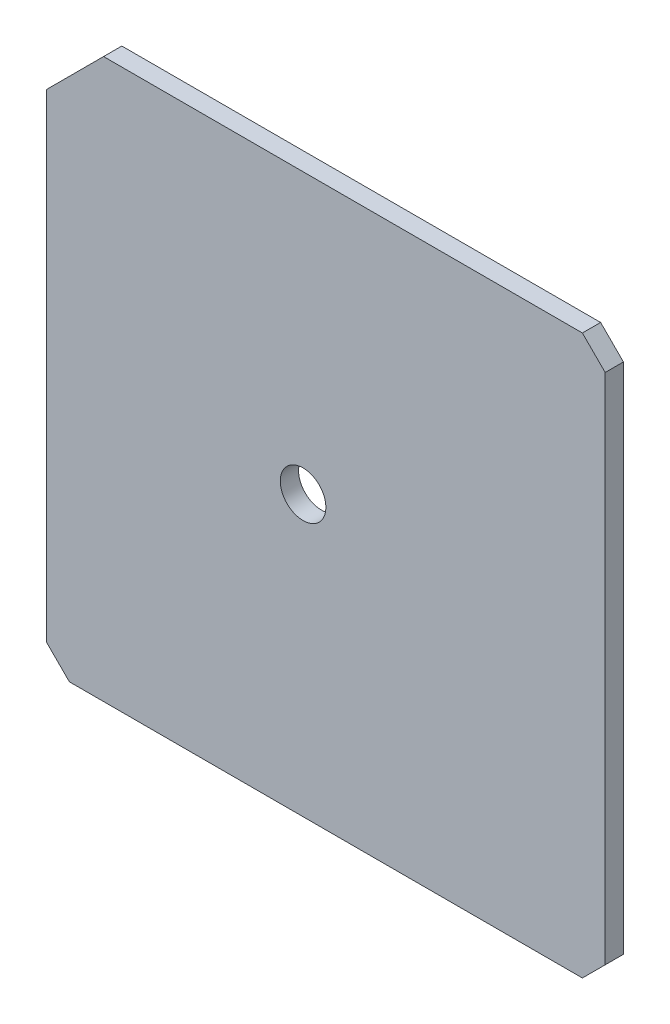
ISO-10303-21;
HEADER;
FILE_DESCRIPTION(('STEP AP214'),'2;1');
FILE_NAME('part.step','',(''),(''),'','','');
FILE_SCHEMA(('AUTOMOTIVE_DESIGN { 1 0 10303 214 1 1 1 1 }'));
ENDSEC;
DATA;
#1=APPLICATION_CONTEXT('core data for automotive mechanical design processes');
#2=APPLICATION_PROTOCOL_DEFINITION('international standard','automotive_design',2000,#1);
#3=PRODUCT_CONTEXT('',#1,'mechanical');
#4=PRODUCT('Part','Part','',(#3));
#5=PRODUCT_RELATED_PRODUCT_CATEGORY('part','',(#4));
#6=PRODUCT_DEFINITION_FORMATION('','',#4);
#7=PRODUCT_DEFINITION_CONTEXT('part definition',#1,'design');
#8=PRODUCT_DEFINITION('design','',#6,#7);
#9=PRODUCT_DEFINITION_SHAPE('','',#8);
#10=(LENGTH_UNIT() NAMED_UNIT(*) SI_UNIT(.MILLI.,.METRE.));
#11=(NAMED_UNIT(*) PLANE_ANGLE_UNIT() SI_UNIT($,.RADIAN.));
#12=(NAMED_UNIT(*) SI_UNIT($,.STERADIAN.) SOLID_ANGLE_UNIT());
#13=UNCERTAINTY_MEASURE_WITH_UNIT(LENGTH_MEASURE(1.E-05),#10,'distance_accuracy_value','');
#14=(GEOMETRIC_REPRESENTATION_CONTEXT(3) GLOBAL_UNCERTAINTY_ASSIGNED_CONTEXT((#13)) GLOBAL_UNIT_ASSIGNED_CONTEXT((#10,
#11,#12)) REPRESENTATION_CONTEXT('',''));
#15=CARTESIAN_POINT('',(0.,0.,0.));
#16=DIRECTION('',(0.,0.,1.));
#17=DIRECTION('',(1.,0.,0.));
#18=AXIS2_PLACEMENT_3D('',#15,#16,#17);
#19=CARTESIAN_POINT('',(0.,0.,-1.6));
#20=DIRECTION('',(0.,-1.,0.));
#21=DIRECTION('',(0.,0.,-1.));
#22=AXIS2_PLACEMENT_3D('',#19,#20,#21);
#23=PLANE('',#22);
#24=DIRECTION('',(1.,0.,0.));
#25=VECTOR('',#24,1.);
#26=CARTESIAN_POINT('',(0.,0.,-1.6));
#27=LINE('',#26,#25);
#28=CARTESIAN_POINT('',(-47.,0.,-1.6));
#29=VERTEX_POINT('',#28);
#30=CARTESIAN_POINT('',(-2.00000000000001,0.,-1.6));
#31=VERTEX_POINT('',#30);
#32=EDGE_CURVE('E164',#29,#31,#27,.T.);
#33=ORIENTED_EDGE('',*,*,#32,.T.);
#34=DIRECTION('',(0.,0.,1.));
#35=VECTOR('',#34,1.);
#36=CARTESIAN_POINT('',(-2.00000000000001,0.,-1.6));
#37=LINE('',#36,#35);
#38=CARTESIAN_POINT('',(-2.00000000000001,0.,0.));
#39=VERTEX_POINT('',#38);
#40=EDGE_CURVE('E50',#31,#39,#37,.T.);
#41=ORIENTED_EDGE('',*,*,#40,.T.);
#42=DIRECTION('',(1.,0.,0.));
#43=VECTOR('',#42,1.);
#44=CARTESIAN_POINT('',(0.,0.,0.));
#45=LINE('',#44,#43);
#46=CARTESIAN_POINT('',(-47.,0.,0.));
#47=VERTEX_POINT('',#46);
#48=EDGE_CURVE('E163',#47,#39,#45,.T.);
#49=ORIENTED_EDGE('',*,*,#48,.F.);
#50=DIRECTION('',(0.,0.,-1.));
#51=VECTOR('',#50,1.);
#52=CARTESIAN_POINT('',(-47.,0.,-1.6));
#53=LINE('',#52,#51);
#54=EDGE_CURVE('E64',#47,#29,#53,.T.);
#55=ORIENTED_EDGE('',*,*,#54,.T.);
#56=EDGE_LOOP('',(#33,#41,#49,#55));
#57=FACE_BOUND('',#56,.T.);
#58=ADVANCED_FACE('F41',(#57),#23,.T.);
#59=CARTESIAN_POINT('',(-49.,0.,-1.6));
#60=DIRECTION('',(-1.,0.,0.));
#61=DIRECTION('',(0.,0.,1.));
#62=AXIS2_PLACEMENT_3D('',#59,#60,#61);
#63=PLANE('',#62);
#64=DIRECTION('',(0.,-1.,0.));
#65=VECTOR('',#64,1.);
#66=CARTESIAN_POINT('',(-49.,0.,-1.6));
#67=LINE('',#66,#65);
#68=CARTESIAN_POINT('',(-49.,44.,-1.6));
#69=VERTEX_POINT('',#68);
#70=CARTESIAN_POINT('',(-49.,2.00000000000001,-1.6));
#71=VERTEX_POINT('',#70);
#72=EDGE_CURVE('E134',#69,#71,#67,.T.);
#73=ORIENTED_EDGE('',*,*,#72,.T.);
#74=DIRECTION('',(0.,0.,1.));
#75=VECTOR('',#74,1.);
#76=CARTESIAN_POINT('',(-49.,2.00000000000001,-1.6));
#77=LINE('',#76,#75);
#78=CARTESIAN_POINT('',(-49.,2.00000000000001,0.));
#79=VERTEX_POINT('',#78);
#80=EDGE_CURVE('E11',#71,#79,#77,.T.);
#81=ORIENTED_EDGE('',*,*,#80,.T.);
#82=DIRECTION('',(0.,-1.,0.));
#83=VECTOR('',#82,1.);
#84=CARTESIAN_POINT('',(-49.,0.,0.));
#85=LINE('',#84,#83);
#86=CARTESIAN_POINT('',(-49.,44.,0.));
#87=VERTEX_POINT('',#86);
#88=EDGE_CURVE('E119',#87,#79,#85,.T.);
#89=ORIENTED_EDGE('',*,*,#88,.F.);
#90=DIRECTION('',(0.,0.,-1.));
#91=VECTOR('',#90,1.);
#92=CARTESIAN_POINT('',(-49.,44.,-1.6));
#93=LINE('',#92,#91);
#94=EDGE_CURVE('E128',#87,#69,#93,.T.);
#95=ORIENTED_EDGE('',*,*,#94,.T.);
#96=EDGE_LOOP('',(#73,#81,#89,#95));
#97=FACE_BOUND('',#96,.T.);
#98=ADVANCED_FACE('F199',(#97),#63,.T.);
#99=CARTESIAN_POINT('',(0.,49.,-1.6));
#100=DIRECTION('',(0.,1.,0.));
#101=DIRECTION('',(0.,0.,1.));
#102=AXIS2_PLACEMENT_3D('',#99,#100,#101);
#103=PLANE('',#102);
#104=DIRECTION('',(-1.,0.,0.));
#105=VECTOR('',#104,1.);
#106=CARTESIAN_POINT('',(0.,49.,0.));
#107=LINE('',#106,#105);
#108=CARTESIAN_POINT('',(-2.00000000000002,49.,0.));
#109=VERTEX_POINT('',#108);
#110=CARTESIAN_POINT('',(-44.,49.,0.));
#111=VERTEX_POINT('',#110);
#112=EDGE_CURVE('E108',#109,#111,#107,.T.);
#113=ORIENTED_EDGE('',*,*,#112,.F.);
#114=DIRECTION('',(0.,0.,-1.));
#115=VECTOR('',#114,1.);
#116=CARTESIAN_POINT('',(-2.00000000000002,49.,-1.6));
#117=LINE('',#116,#115);
#118=CARTESIAN_POINT('',(-2.00000000000002,49.,-1.6));
#119=VERTEX_POINT('',#118);
#120=EDGE_CURVE('E153',#109,#119,#117,.T.);
#121=ORIENTED_EDGE('',*,*,#120,.T.);
#122=DIRECTION('',(-1.,0.,0.));
#123=VECTOR('',#122,1.);
#124=CARTESIAN_POINT('',(0.,49.,-1.6));
#125=LINE('',#124,#123);
#126=CARTESIAN_POINT('',(-44.,49.,-1.6));
#127=VERTEX_POINT('',#126);
#128=EDGE_CURVE('E132',#119,#127,#125,.T.);
#129=ORIENTED_EDGE('',*,*,#128,.T.);
#130=DIRECTION('',(0.,0.,1.));
#131=VECTOR('',#130,1.);
#132=CARTESIAN_POINT('',(-44.,49.,-1.6));
#133=LINE('',#132,#131);
#134=EDGE_CURVE('E127',#127,#111,#133,.T.);
#135=ORIENTED_EDGE('',*,*,#134,.T.);
#136=EDGE_LOOP('',(#113,#121,#129,#135));
#137=FACE_BOUND('',#136,.T.);
#138=ADVANCED_FACE('F130',(#137),#103,.T.);
#139=CARTESIAN_POINT('',(0.,0.,-1.6));
#140=DIRECTION('',(1.,0.,0.));
#141=DIRECTION('',(0.,0.,-1.));
#142=AXIS2_PLACEMENT_3D('',#139,#140,#141);
#143=PLANE('',#142);
#144=DIRECTION('',(0.,1.,0.));
#145=VECTOR('',#144,1.);
#146=CARTESIAN_POINT('',(0.,0.,-1.6));
#147=LINE('',#146,#145);
#148=CARTESIAN_POINT('',(0.,2.00000000000002,-1.6));
#149=VERTEX_POINT('',#148);
#150=CARTESIAN_POINT('',(0.,47.,-1.6));
#151=VERTEX_POINT('',#150);
#152=EDGE_CURVE('E175',#149,#151,#147,.T.);
#153=ORIENTED_EDGE('',*,*,#152,.T.);
#154=DIRECTION('',(0.,0.,1.));
#155=VECTOR('',#154,1.);
#156=CARTESIAN_POINT('',(0.,47.,-1.6));
#157=LINE('',#156,#155);
#158=CARTESIAN_POINT('',(0.,47.,0.));
#159=VERTEX_POINT('',#158);
#160=EDGE_CURVE('E145',#151,#159,#157,.T.);
#161=ORIENTED_EDGE('',*,*,#160,.T.);
#162=DIRECTION('',(0.,1.,0.));
#163=VECTOR('',#162,1.);
#164=CARTESIAN_POINT('',(0.,0.,0.));
#165=LINE('',#164,#163);
#166=CARTESIAN_POINT('',(0.,2.00000000000002,0.));
#167=VERTEX_POINT('',#166);
#168=EDGE_CURVE('E120',#167,#159,#165,.T.);
#169=ORIENTED_EDGE('',*,*,#168,.F.);
#170=DIRECTION('',(0.,0.,-1.));
#171=VECTOR('',#170,1.);
#172=CARTESIAN_POINT('',(0.,2.00000000000002,-1.6));
#173=LINE('',#172,#171);
#174=EDGE_CURVE('E143',#167,#149,#173,.T.);
#175=ORIENTED_EDGE('',*,*,#174,.T.);
#176=EDGE_LOOP('',(#153,#161,#169,#175));
#177=FACE_BOUND('',#176,.T.);
#178=ADVANCED_FACE('F194',(#177),#143,.T.);
#179=CARTESIAN_POINT('',(0.,0.,-1.6));
#180=DIRECTION('',(0.,0.,-1.));
#181=DIRECTION('',(-1.,0.,0.));
#182=AXIS2_PLACEMENT_3D('',#179,#180,#181);
#183=PLANE('',#182);
#184=CARTESIAN_POINT('',(-26.5,24.5,-1.6));
#185=DIRECTION('',(0.,0.,1.));
#186=DIRECTION('',(1.,0.,0.));
#187=AXIS2_PLACEMENT_3D('',#184,#185,#186);
#188=CIRCLE('',#187,2.);
#189=CARTESIAN_POINT('',(-24.5,24.5,-1.6));
#190=VERTEX_POINT('',#189);
#191=EDGE_CURVE('E167',#190,#190,#188,.T.);
#192=ORIENTED_EDGE('',*,*,#191,.T.);
#193=EDGE_LOOP('',(#192));
#194=FACE_BOUND('',#193,.T.);
#195=ORIENTED_EDGE('',*,*,#128,.F.);
#196=DIRECTION('',(-0.707106781186549,0.707106781186546,0.));
#197=VECTOR('',#196,1.);
#198=CARTESIAN_POINT('',(23.5,23.5000000000001,-1.6));
#199=LINE('',#198,#197);
#200=EDGE_CURVE('E158',#119,#151,#199,.F.);
#201=ORIENTED_EDGE('',*,*,#200,.T.);
#202=ORIENTED_EDGE('',*,*,#152,.F.);
#203=DIRECTION('',(0.707106781186546,0.707106781186549,0.));
#204=VECTOR('',#203,1.);
#205=CARTESIAN_POINT('',(-1.00000000000001,1.,-1.6));
#206=LINE('',#205,#204);
#207=EDGE_CURVE('E57',#149,#31,#206,.F.);
#208=ORIENTED_EDGE('',*,*,#207,.T.);
#209=ORIENTED_EDGE('',*,*,#32,.F.);
#210=DIRECTION('',(0.707106781186549,-0.707106781186546,0.));
#211=VECTOR('',#210,1.);
#212=CARTESIAN_POINT('',(-23.4999999999999,-23.5,-1.6));
#213=LINE('',#212,#211);
#214=EDGE_CURVE('E155',#29,#71,#213,.F.);
#215=ORIENTED_EDGE('',*,*,#214,.T.);
#216=ORIENTED_EDGE('',*,*,#72,.F.);
#217=DIRECTION('',(-0.707106781186546,-0.70710678118655,0.));
#218=VECTOR('',#217,1.);
#219=CARTESIAN_POINT('',(-46.5000000000001,46.4999999999999,-1.6));
#220=LINE('',#219,#218);
#221=EDGE_CURVE('E141',#69,#127,#220,.F.);
#222=ORIENTED_EDGE('',*,*,#221,.T.);
#223=EDGE_LOOP('',(#195,#201,#202,#208,#209,#215,#216,#222));
#224=FACE_BOUND('',#223,.T.);
#225=ADVANCED_FACE('F185',(#194,#224),#183,.T.);
#226=CARTESIAN_POINT('',(0.,0.,0.));
#227=DIRECTION('',(0.,0.,-1.));
#228=DIRECTION('',(-1.,0.,0.));
#229=AXIS2_PLACEMENT_3D('',#226,#227,#228);
#230=PLANE('',#229);
#231=CARTESIAN_POINT('',(-26.5,24.5,0.));
#232=DIRECTION('',(0.,0.,1.));
#233=DIRECTION('',(1.,0.,0.));
#234=AXIS2_PLACEMENT_3D('',#231,#232,#233);
#235=CIRCLE('',#234,2.);
#236=CARTESIAN_POINT('',(-24.5,24.5,0.));
#237=VERTEX_POINT('',#236);
#238=EDGE_CURVE('E171',#237,#237,#235,.T.);
#239=ORIENTED_EDGE('',*,*,#238,.F.);
#240=EDGE_LOOP('',(#239));
#241=FACE_BOUND('',#240,.T.);
#242=ORIENTED_EDGE('',*,*,#168,.T.);
#243=DIRECTION('',(0.707106781186549,-0.707106781186546,0.));
#244=VECTOR('',#243,1.);
#245=CARTESIAN_POINT('',(0.,47.,0.));
#246=LINE('',#245,#244);
#247=EDGE_CURVE('E115',#159,#109,#246,.F.);
#248=ORIENTED_EDGE('',*,*,#247,.T.);
#249=ORIENTED_EDGE('',*,*,#112,.T.);
#250=DIRECTION('',(0.707106781186546,0.70710678118655,0.));
#251=VECTOR('',#250,1.);
#252=CARTESIAN_POINT('',(-44.,49.,0.));
#253=LINE('',#252,#251);
#254=EDGE_CURVE('E113',#111,#87,#253,.F.);
#255=ORIENTED_EDGE('',*,*,#254,.T.);
#256=ORIENTED_EDGE('',*,*,#88,.T.);
#257=DIRECTION('',(-0.707106781186549,0.707106781186546,0.));
#258=VECTOR('',#257,1.);
#259=CARTESIAN_POINT('',(-49.,2.00000000000001,0.));
#260=LINE('',#259,#258);
#261=EDGE_CURVE('E148',#79,#47,#260,.F.);
#262=ORIENTED_EDGE('',*,*,#261,.T.);
#263=ORIENTED_EDGE('',*,*,#48,.T.);
#264=DIRECTION('',(-0.707106781186546,-0.707106781186549,0.));
#265=VECTOR('',#264,1.);
#266=CARTESIAN_POINT('',(-2.00000000000001,0.,0.));
#267=LINE('',#266,#265);
#268=EDGE_CURVE('E150',#39,#167,#267,.F.);
#269=ORIENTED_EDGE('',*,*,#268,.T.);
#270=EDGE_LOOP('',(#242,#248,#249,#255,#256,#262,#263,#269));
#271=FACE_BOUND('',#270,.T.);
#272=ADVANCED_FACE('F111',(#241,#271),#230,.F.);
#273=CARTESIAN_POINT('',(-26.5,24.5,-1.6));
#274=DIRECTION('',(0.,0.,1.));
#275=DIRECTION('',(1.,0.,0.));
#276=AXIS2_PLACEMENT_3D('',#273,#274,#275);
#277=CYLINDRICAL_SURFACE('',#276,2.);
#278=ORIENTED_EDGE('',*,*,#191,.F.);
#279=EDGE_LOOP('',(#278));
#280=FACE_BOUND('',#279,.T.);
#281=ORIENTED_EDGE('',*,*,#238,.T.);
#282=EDGE_LOOP('',(#281));
#283=FACE_BOUND('',#282,.T.);
#284=ADVANCED_FACE('F182',(#280,#283),#277,.F.);
#285=CARTESIAN_POINT('',(-44.,49.,-1.6));
#286=DIRECTION('',(0.707106781186549,-0.707106781186545,0.));
#287=DIRECTION('',(0.,0.,1.));
#288=AXIS2_PLACEMENT_3D('',#285,#286,#287);
#289=PLANE('',#288);
#290=ORIENTED_EDGE('',*,*,#221,.F.);
#291=ORIENTED_EDGE('',*,*,#94,.F.);
#292=ORIENTED_EDGE('',*,*,#254,.F.);
#293=ORIENTED_EDGE('',*,*,#134,.F.);
#294=EDGE_LOOP('',(#290,#291,#292,#293));
#295=FACE_BOUND('',#294,.T.);
#296=ADVANCED_FACE('F126',(#295),#289,.F.);
#297=CARTESIAN_POINT('',(0.,47.,-1.6));
#298=DIRECTION('',(-0.707106781186546,-0.707106781186549,0.));
#299=DIRECTION('',(0.,0.,1.));
#300=AXIS2_PLACEMENT_3D('',#297,#298,#299);
#301=PLANE('',#300);
#302=ORIENTED_EDGE('',*,*,#200,.F.);
#303=ORIENTED_EDGE('',*,*,#120,.F.);
#304=ORIENTED_EDGE('',*,*,#247,.F.);
#305=ORIENTED_EDGE('',*,*,#160,.F.);
#306=EDGE_LOOP('',(#302,#303,#304,#305));
#307=FACE_BOUND('',#306,.T.);
#308=ADVANCED_FACE('F214',(#307),#301,.F.);
#309=CARTESIAN_POINT('',(-2.00000000000001,0.,-1.6));
#310=DIRECTION('',(-0.707106781186549,0.707106781186546,0.));
#311=DIRECTION('',(0.,0.,1.));
#312=AXIS2_PLACEMENT_3D('',#309,#310,#311);
#313=PLANE('',#312);
#314=ORIENTED_EDGE('',*,*,#207,.F.);
#315=ORIENTED_EDGE('',*,*,#174,.F.);
#316=ORIENTED_EDGE('',*,*,#268,.F.);
#317=ORIENTED_EDGE('',*,*,#40,.F.);
#318=EDGE_LOOP('',(#314,#315,#316,#317));
#319=FACE_BOUND('',#318,.T.);
#320=ADVANCED_FACE('F218',(#319),#313,.F.);
#321=CARTESIAN_POINT('',(-49.,2.00000000000001,-1.6));
#322=DIRECTION('',(0.707106781186546,0.707106781186549,0.));
#323=DIRECTION('',(0.,0.,1.));
#324=AXIS2_PLACEMENT_3D('',#321,#322,#323);
#325=PLANE('',#324);
#326=ORIENTED_EDGE('',*,*,#214,.F.);
#327=ORIENTED_EDGE('',*,*,#54,.F.);
#328=ORIENTED_EDGE('',*,*,#261,.F.);
#329=ORIENTED_EDGE('',*,*,#80,.F.);
#330=EDGE_LOOP('',(#326,#327,#328,#329));
#331=FACE_BOUND('',#330,.T.);
#332=ADVANCED_FACE('F44',(#331),#325,.F.);
#333=CLOSED_SHELL('',(#58,#98,#138,#178,#225,#272,#284,#296,#308,#320,#332));
#334=MANIFOLD_SOLID_BREP('B2',#333);
#335=ADVANCED_BREP_SHAPE_REPRESENTATION('',(#18,#334),#14);
#336=SHAPE_DEFINITION_REPRESENTATION(#9,#335);
ENDSEC;
END-ISO-10303-21;
